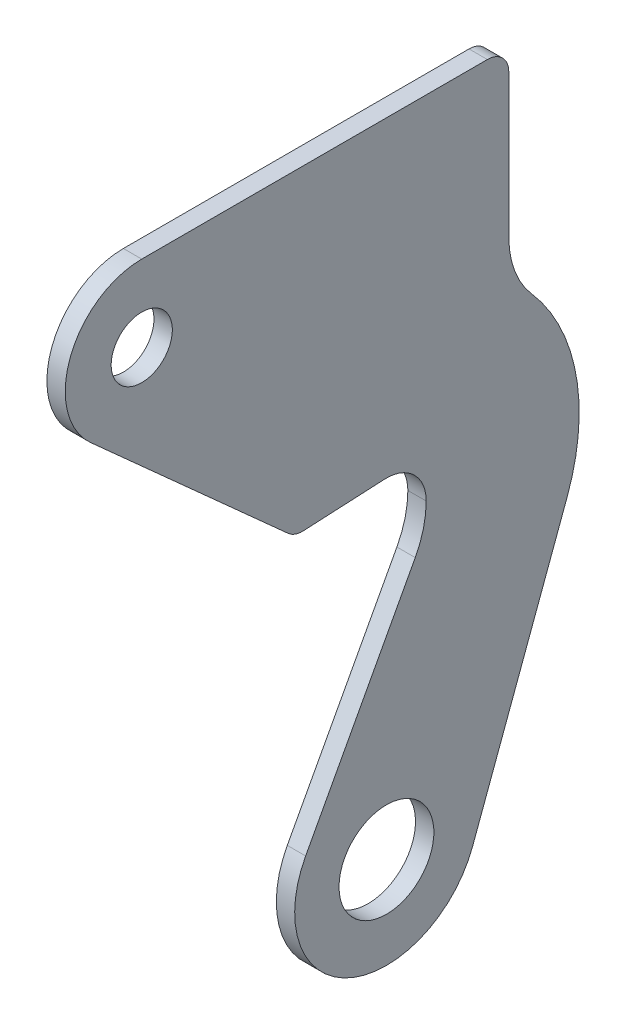
ISO-10303-21;
HEADER;
FILE_DESCRIPTION(('STEP AP214'),'2;1');
FILE_NAME('part.step','',(''),(''),'','','');
FILE_SCHEMA(('AUTOMOTIVE_DESIGN { 1 0 10303 214 1 1 1 1 }'));
ENDSEC;
DATA;
#1=APPLICATION_CONTEXT('core data for automotive mechanical design processes');
#2=APPLICATION_PROTOCOL_DEFINITION('international standard','automotive_design',2000,#1);
#3=PRODUCT_CONTEXT('',#1,'mechanical');
#4=PRODUCT('Part','Part','',(#3));
#5=PRODUCT_RELATED_PRODUCT_CATEGORY('part','',(#4));
#6=PRODUCT_DEFINITION_FORMATION('','',#4);
#7=PRODUCT_DEFINITION_CONTEXT('part definition',#1,'design');
#8=PRODUCT_DEFINITION('design','',#6,#7);
#9=PRODUCT_DEFINITION_SHAPE('','',#8);
#10=(LENGTH_UNIT() NAMED_UNIT(*) SI_UNIT(.MILLI.,.METRE.));
#11=(NAMED_UNIT(*) PLANE_ANGLE_UNIT() SI_UNIT($,.RADIAN.));
#12=(NAMED_UNIT(*) SI_UNIT($,.STERADIAN.) SOLID_ANGLE_UNIT());
#13=UNCERTAINTY_MEASURE_WITH_UNIT(LENGTH_MEASURE(1.E-05),#10,'distance_accuracy_value','');
#14=(GEOMETRIC_REPRESENTATION_CONTEXT(3) GLOBAL_UNCERTAINTY_ASSIGNED_CONTEXT((#13)) GLOBAL_UNIT_ASSIGNED_CONTEXT((#10,
#11,#12)) REPRESENTATION_CONTEXT('',''));
#15=CARTESIAN_POINT('',(0.,0.,0.));
#16=DIRECTION('',(0.,0.,1.));
#17=DIRECTION('',(1.,0.,0.));
#18=AXIS2_PLACEMENT_3D('',#15,#16,#17);
#19=CARTESIAN_POINT('',(0.762,24.13,0.));
#20=DIRECTION('',(-1.,0.,0.));
#21=DIRECTION('',(0.,0.,1.));
#22=AXIS2_PLACEMENT_3D('',#19,#20,#21);
#23=PLANE('',#22);
#24=CARTESIAN_POINT('',(0.762,24.13,0.));
#25=DIRECTION('',(1.,0.,0.));
#26=DIRECTION('',(0.,0.,1.));
#27=AXIS2_PLACEMENT_3D('',#24,#25,#26);
#28=CIRCLE('',#27,16.002);
#29=CARTESIAN_POINT('',(0.762,18.5714105263158,-15.0055352141484));
#30=VERTEX_POINT('',#29);
#31=CARTESIAN_POINT('',(0.762,34.6653516893117,-12.0445161290322));
#32=VERTEX_POINT('',#31);
#33=EDGE_CURVE('E203',#30,#32,#28,.T.);
#34=ORIENTED_EDGE('',*,*,#33,.T.);
#35=CARTESIAN_POINT('',(0.762,39.6821858270791,-17.78));
#36=DIRECTION('',(-1.,0.,0.));
#37=DIRECTION('',(0.,0.,1.));
#38=AXIS2_PLACEMENT_3D('',#35,#36,#37);
#39=CIRCLE('',#38,7.62);
#40=CARTESIAN_POINT('',(0.762,39.6821858270791,-10.16));
#41=VERTEX_POINT('',#40);
#42=EDGE_CURVE('E11',#32,#41,#39,.T.);
#43=ORIENTED_EDGE('',*,*,#42,.T.);
#44=DIRECTION('',(0.,1.,0.));
#45=VECTOR('',#44,1.);
#46=CARTESIAN_POINT('',(0.762,53.34,-10.16));
#47=LINE('',#46,#45);
#48=CARTESIAN_POINT('',(0.762,51.562,-10.16));
#49=VERTEX_POINT('',#48);
#50=EDGE_CURVE('E147',#41,#49,#47,.T.);
#51=ORIENTED_EDGE('',*,*,#50,.T.);
#52=CARTESIAN_POINT('',(0.762,51.562,-8.38199999999999));
#53=DIRECTION('',(-1.,0.,0.));
#54=DIRECTION('',(0.,0.,1.));
#55=AXIS2_PLACEMENT_3D('',#52,#53,#54);
#56=CIRCLE('',#55,1.778);
#57=CARTESIAN_POINT('',(0.762,53.34,-8.38199999999999));
#58=VERTEX_POINT('',#57);
#59=EDGE_CURVE('E143',#49,#58,#56,.F.);
#60=ORIENTED_EDGE('',*,*,#59,.T.);
#61=DIRECTION('',(0.,0.,1.));
#62=VECTOR('',#61,1.);
#63=CARTESIAN_POINT('',(0.762,53.34,20.32));
#64=LINE('',#63,#62);
#65=CARTESIAN_POINT('',(0.762,53.34,20.32));
#66=VERTEX_POINT('',#65);
#67=EDGE_CURVE('E135',#58,#66,#64,.T.);
#68=ORIENTED_EDGE('',*,*,#67,.T.);
#69=CARTESIAN_POINT('',(0.762,46.99,20.32));
#70=DIRECTION('',(1.,0.,0.));
#71=DIRECTION('',(0.,0.,1.));
#72=AXIS2_PLACEMENT_3D('',#69,#70,#71);
#73=CIRCLE('',#72,6.35);
#74=CARTESIAN_POINT('',(0.762,42.2653642791483,24.5626780817371));
#75=VERTEX_POINT('',#74);
#76=EDGE_CURVE('E140',#66,#75,#73,.T.);
#77=ORIENTED_EDGE('',*,*,#76,.T.);
#78=DIRECTION('',(0.,-0.668138280588521,-0.744037121393963));
#79=VECTOR('',#78,1.);
#80=CARTESIAN_POINT('',(0.762,27.051,7.62));
#81=LINE('',#80,#79);
#82=CARTESIAN_POINT('',(0.762,27.5408506966821,8.16549651301392));
#83=VERTEX_POINT('',#82);
#84=EDGE_CURVE('E162',#75,#83,#81,.T.);
#85=ORIENTED_EDGE('',*,*,#84,.T.);
#86=CARTESIAN_POINT('',(0.762,28.8637486985205,6.97754665012753));
#87=DIRECTION('',(-1.,0.,0.));
#88=DIRECTION('',(0.,0.,1.));
#89=AXIS2_PLACEMENT_3D('',#86,#87,#88);
#90=CIRCLE('',#89,1.778);
#91=CARTESIAN_POINT('',(0.762,27.0880163197851,6.88777739530944));
#92=VERTEX_POINT('',#91);
#93=EDGE_CURVE('E231',#83,#92,#90,.F.);
#94=ORIENTED_EDGE('',*,*,#93,.T.);
#95=DIRECTION('',(0.,0.0504888947233312,-0.998724622460874));
#96=VECTOR('',#95,1.);
#97=CARTESIAN_POINT('',(0.762,27.4277887033658,0.166714330376441));
#98=LINE('',#97,#96);
#99=CARTESIAN_POINT('',(0.762,27.4277887033658,0.166714330376441));
#100=VERTEX_POINT('',#99);
#101=EDGE_CURVE('E164',#92,#100,#98,.T.);
#102=ORIENTED_EDGE('',*,*,#101,.T.);
#103=CARTESIAN_POINT('',(0.762,24.13,0.));
#104=DIRECTION('',(-1.,0.,0.));
#105=DIRECTION('',(0.,0.,-1.));
#106=AXIS2_PLACEMENT_3D('',#103,#104,#105);
#107=CIRCLE('',#106,3.302);
#108=CARTESIAN_POINT('',(0.762,24.13,-3.302));
#109=VERTEX_POINT('',#108);
#110=EDGE_CURVE('E169',#100,#109,#107,.T.);
#111=ORIENTED_EDGE('',*,*,#110,.T.);
#112=CARTESIAN_POINT('',(0.762,24.13,4.318));
#113=DIRECTION('',(-1.,0.,0.));
#114=DIRECTION('',(0.,0.,1.));
#115=AXIS2_PLACEMENT_3D('',#112,#113,#114);
#116=CIRCLE('',#115,7.62);
#117=CARTESIAN_POINT('',(0.762,20.518024345724,-2.39154781434023));
#118=VERTEX_POINT('',#117);
#119=EDGE_CURVE('E171',#109,#118,#116,.T.);
#120=ORIENTED_EDGE('',*,*,#119,.T.);
#121=DIRECTION('',(0.,-0.880518085871421,0.474012553054588));
#122=VECTOR('',#121,1.);
#123=CARTESIAN_POINT('',(0.762,20.518024345724,-2.39154781434023));
#124=LINE('',#123,#122);
#125=CARTESIAN_POINT('',(0.762,3.61197565427596,6.70954781434023));
#126=VERTEX_POINT('',#125);
#127=EDGE_CURVE('E173',#118,#126,#124,.T.);
#128=ORIENTED_EDGE('',*,*,#127,.T.);
#129=CARTESIAN_POINT('',(0.762,0.,0.));
#130=DIRECTION('',(1.,0.,0.));
#131=DIRECTION('',(0.,0.,-1.));
#132=AXIS2_PLACEMENT_3D('',#129,#130,#131);
#133=CIRCLE('',#132,7.62);
#134=CARTESIAN_POINT('',(0.762,-2.64694736842105,-7.14549295911828));
#135=VERTEX_POINT('',#134);
#136=EDGE_CURVE('E175',#126,#135,#133,.T.);
#137=ORIENTED_EDGE('',*,*,#136,.T.);
#138=DIRECTION('',(0.,0.937728734792425,-0.347368421052632));
#139=VECTOR('',#138,1.);
#140=CARTESIAN_POINT('',(0.762,18.5714105263158,-15.0055352141484));
#141=LINE('',#140,#139);
#142=EDGE_CURVE('E177',#135,#30,#141,.T.);
#143=ORIENTED_EDGE('',*,*,#142,.T.);
#144=EDGE_LOOP('',(#34,#43,#51,#60,#68,#77,#85,#94,#102,#111,#120,#128,#137,#143));
#145=FACE_BOUND('',#144,.T.);
#146=CARTESIAN_POINT('',(0.762,0.,0.));
#147=DIRECTION('',(1.,0.,0.));
#148=DIRECTION('',(0.,0.,-1.));
#149=AXIS2_PLACEMENT_3D('',#146,#147,#148);
#150=CIRCLE('',#149,3.937);
#151=CARTESIAN_POINT('',(0.762,0.,3.937));
#152=VERTEX_POINT('',#151);
#153=EDGE_CURVE('E183',#152,#152,#150,.T.);
#154=ORIENTED_EDGE('',*,*,#153,.F.);
#155=EDGE_LOOP('',(#154));
#156=FACE_BOUND('',#155,.T.);
#157=CARTESIAN_POINT('',(0.762,46.99,20.32));
#158=DIRECTION('',(1.,0.,0.));
#159=DIRECTION('',(0.,0.,-1.));
#160=AXIS2_PLACEMENT_3D('',#157,#158,#159);
#161=CIRCLE('',#160,2.54000000000001);
#162=CARTESIAN_POINT('',(0.762,46.99,22.86));
#163=VERTEX_POINT('',#162);
#164=EDGE_CURVE('E320',#163,#163,#161,.T.);
#165=ORIENTED_EDGE('',*,*,#164,.F.);
#166=EDGE_LOOP('',(#165));
#167=FACE_BOUND('',#166,.T.);
#168=ADVANCED_FACE('F35',(#145,#156,#167),#23,.F.);
#169=CARTESIAN_POINT('',(-0.762,24.13,0.));
#170=DIRECTION('',(-1.,0.,0.));
#171=DIRECTION('',(0.,0.,1.));
#172=AXIS2_PLACEMENT_3D('',#169,#170,#171);
#173=PLANE('',#172);
#174=CARTESIAN_POINT('',(-0.762,0.,0.));
#175=DIRECTION('',(1.,0.,0.));
#176=DIRECTION('',(0.,0.,-1.));
#177=AXIS2_PLACEMENT_3D('',#174,#175,#176);
#178=CIRCLE('',#177,3.937);
#179=CARTESIAN_POINT('',(-0.762,0.,3.937));
#180=VERTEX_POINT('',#179);
#181=EDGE_CURVE('E317',#180,#180,#178,.T.);
#182=ORIENTED_EDGE('',*,*,#181,.T.);
#183=EDGE_LOOP('',(#182));
#184=FACE_BOUND('',#183,.T.);
#185=DIRECTION('',(0.,0.,1.));
#186=VECTOR('',#185,1.);
#187=CARTESIAN_POINT('',(-0.762,53.34,20.32));
#188=LINE('',#187,#186);
#189=CARTESIAN_POINT('',(-0.762,53.34,-8.38199999999999));
#190=VERTEX_POINT('',#189);
#191=CARTESIAN_POINT('',(-0.762,53.34,20.32));
#192=VERTEX_POINT('',#191);
#193=EDGE_CURVE('E153',#190,#192,#188,.T.);
#194=ORIENTED_EDGE('',*,*,#193,.F.);
#195=CARTESIAN_POINT('',(-0.762,51.562,-8.38199999999999));
#196=DIRECTION('',(-1.,0.,0.));
#197=DIRECTION('',(0.,0.,1.));
#198=AXIS2_PLACEMENT_3D('',#195,#196,#197);
#199=CIRCLE('',#198,1.778);
#200=CARTESIAN_POINT('',(-0.762,51.562,-10.16));
#201=VERTEX_POINT('',#200);
#202=EDGE_CURVE('E225',#190,#201,#199,.T.);
#203=ORIENTED_EDGE('',*,*,#202,.T.);
#204=DIRECTION('',(0.,1.,0.));
#205=VECTOR('',#204,1.);
#206=CARTESIAN_POINT('',(-0.762,53.34,-10.16));
#207=LINE('',#206,#205);
#208=CARTESIAN_POINT('',(-0.762,39.6821858270791,-10.16));
#209=VERTEX_POINT('',#208);
#210=EDGE_CURVE('E182',#209,#201,#207,.T.);
#211=ORIENTED_EDGE('',*,*,#210,.F.);
#212=CARTESIAN_POINT('',(-0.762,39.6821858270791,-17.78));
#213=DIRECTION('',(-1.,0.,0.));
#214=DIRECTION('',(0.,0.,1.));
#215=AXIS2_PLACEMENT_3D('',#212,#213,#214);
#216=CIRCLE('',#215,7.62);
#217=CARTESIAN_POINT('',(-0.762,34.6653516893117,-12.0445161290322));
#218=VERTEX_POINT('',#217);
#219=EDGE_CURVE('E43',#209,#218,#216,.F.);
#220=ORIENTED_EDGE('',*,*,#219,.T.);
#221=CARTESIAN_POINT('',(-0.762,24.13,0.));
#222=DIRECTION('',(1.,0.,0.));
#223=DIRECTION('',(0.,0.,1.));
#224=AXIS2_PLACEMENT_3D('',#221,#222,#223);
#225=CIRCLE('',#224,16.002);
#226=CARTESIAN_POINT('',(-0.762,18.5714105263158,-15.0055352141484));
#227=VERTEX_POINT('',#226);
#228=EDGE_CURVE('E180',#227,#218,#225,.T.);
#229=ORIENTED_EDGE('',*,*,#228,.F.);
#230=DIRECTION('',(0.,0.937728734792425,-0.347368421052632));
#231=VECTOR('',#230,1.);
#232=CARTESIAN_POINT('',(-0.762,18.5714105263158,-15.0055352141484));
#233=LINE('',#232,#231);
#234=CARTESIAN_POINT('',(-0.762,-2.64694736842105,-7.14549295911828));
#235=VERTEX_POINT('',#234);
#236=EDGE_CURVE('E201',#235,#227,#233,.T.);
#237=ORIENTED_EDGE('',*,*,#236,.F.);
#238=CARTESIAN_POINT('',(-0.762,0.,0.));
#239=DIRECTION('',(1.,0.,0.));
#240=DIRECTION('',(0.,0.,-1.));
#241=AXIS2_PLACEMENT_3D('',#238,#239,#240);
#242=CIRCLE('',#241,7.62);
#243=CARTESIAN_POINT('',(-0.762,3.61197565427596,6.70954781434023));
#244=VERTEX_POINT('',#243);
#245=EDGE_CURVE('E199',#244,#235,#242,.T.);
#246=ORIENTED_EDGE('',*,*,#245,.F.);
#247=DIRECTION('',(0.,-0.880518085871421,0.474012553054588));
#248=VECTOR('',#247,1.);
#249=CARTESIAN_POINT('',(-0.762,20.518024345724,-2.39154781434023));
#250=LINE('',#249,#248);
#251=CARTESIAN_POINT('',(-0.762,20.518024345724,-2.39154781434023));
#252=VERTEX_POINT('',#251);
#253=EDGE_CURVE('E197',#252,#244,#250,.T.);
#254=ORIENTED_EDGE('',*,*,#253,.F.);
#255=CARTESIAN_POINT('',(-0.762,24.13,4.318));
#256=DIRECTION('',(-1.,0.,0.));
#257=DIRECTION('',(0.,0.,1.));
#258=AXIS2_PLACEMENT_3D('',#255,#256,#257);
#259=CIRCLE('',#258,7.62);
#260=CARTESIAN_POINT('',(-0.762,24.13,-3.302));
#261=VERTEX_POINT('',#260);
#262=EDGE_CURVE('E195',#261,#252,#259,.T.);
#263=ORIENTED_EDGE('',*,*,#262,.F.);
#264=CARTESIAN_POINT('',(-0.762,24.13,0.));
#265=DIRECTION('',(-1.,0.,0.));
#266=DIRECTION('',(0.,0.,-1.));
#267=AXIS2_PLACEMENT_3D('',#264,#265,#266);
#268=CIRCLE('',#267,3.302);
#269=CARTESIAN_POINT('',(-0.762,27.4277887033658,0.166714330376441));
#270=VERTEX_POINT('',#269);
#271=EDGE_CURVE('E193',#270,#261,#268,.T.);
#272=ORIENTED_EDGE('',*,*,#271,.F.);
#273=DIRECTION('',(0.,0.0504888947233312,-0.998724622460874));
#274=VECTOR('',#273,1.);
#275=CARTESIAN_POINT('',(-0.762,27.4277887033658,0.166714330376441));
#276=LINE('',#275,#274);
#277=CARTESIAN_POINT('',(-0.762,27.0880163197851,6.88777739530944));
#278=VERTEX_POINT('',#277);
#279=EDGE_CURVE('E191',#278,#270,#276,.T.);
#280=ORIENTED_EDGE('',*,*,#279,.F.);
#281=CARTESIAN_POINT('',(-0.762,28.8637486985205,6.97754665012753));
#282=DIRECTION('',(-1.,0.,0.));
#283=DIRECTION('',(0.,0.,1.));
#284=AXIS2_PLACEMENT_3D('',#281,#282,#283);
#285=CIRCLE('',#284,1.778);
#286=CARTESIAN_POINT('',(-0.762,27.5408506966821,8.16549651301392));
#287=VERTEX_POINT('',#286);
#288=EDGE_CURVE('E223',#278,#287,#285,.T.);
#289=ORIENTED_EDGE('',*,*,#288,.T.);
#290=DIRECTION('',(0.,-0.668138280588521,-0.744037121393963));
#291=VECTOR('',#290,1.);
#292=CARTESIAN_POINT('',(-0.762,27.051,7.62));
#293=LINE('',#292,#291);
#294=CARTESIAN_POINT('',(-0.762,42.2653642791483,24.5626780817371));
#295=VERTEX_POINT('',#294);
#296=EDGE_CURVE('E188',#295,#287,#293,.T.);
#297=ORIENTED_EDGE('',*,*,#296,.F.);
#298=CARTESIAN_POINT('',(-0.762,46.99,20.32));
#299=DIRECTION('',(1.,0.,0.));
#300=DIRECTION('',(0.,0.,1.));
#301=AXIS2_PLACEMENT_3D('',#298,#299,#300);
#302=CIRCLE('',#301,6.35);
#303=EDGE_CURVE('E186',#192,#295,#302,.T.);
#304=ORIENTED_EDGE('',*,*,#303,.F.);
#305=EDGE_LOOP('',(#194,#203,#211,#220,#229,#237,#246,#254,#263,#272,#280,#289,#297,#304));
#306=FACE_BOUND('',#305,.T.);
#307=CARTESIAN_POINT('',(-0.762,46.99,20.32));
#308=DIRECTION('',(1.,0.,0.));
#309=DIRECTION('',(0.,0.,-1.));
#310=AXIS2_PLACEMENT_3D('',#307,#308,#309);
#311=CIRCLE('',#310,2.54000000000001);
#312=CARTESIAN_POINT('',(-0.762,46.99,22.86));
#313=VERTEX_POINT('',#312);
#314=EDGE_CURVE('E323',#313,#313,#311,.T.);
#315=ORIENTED_EDGE('',*,*,#314,.T.);
#316=EDGE_LOOP('',(#315));
#317=FACE_BOUND('',#316,.T.);
#318=ADVANCED_FACE('F248',(#184,#306,#317),#173,.T.);
#319=CARTESIAN_POINT('',(0.762,24.13,0.));
#320=DIRECTION('',(-1.,0.,0.));
#321=DIRECTION('',(0.,0.,1.));
#322=AXIS2_PLACEMENT_3D('',#319,#320,#321);
#323=CYLINDRICAL_SURFACE('',#322,16.002);
#324=ORIENTED_EDGE('',*,*,#228,.T.);
#325=DIRECTION('',(-1.,0.,0.));
#326=VECTOR('',#325,1.);
#327=CARTESIAN_POINT('',(0.762,34.6653516893117,-12.0445161290322));
#328=LINE('',#327,#326);
#329=EDGE_CURVE('E50',#218,#32,#328,.F.);
#330=ORIENTED_EDGE('',*,*,#329,.T.);
#331=ORIENTED_EDGE('',*,*,#33,.F.);
#332=DIRECTION('',(-1.,0.,0.));
#333=VECTOR('',#332,1.);
#334=CARTESIAN_POINT('',(0.762,18.5714105263158,-15.0055352141484));
#335=LINE('',#334,#333);
#336=EDGE_CURVE('E179',#30,#227,#335,.T.);
#337=ORIENTED_EDGE('',*,*,#336,.T.);
#338=EDGE_LOOP('',(#324,#330,#331,#337));
#339=FACE_BOUND('',#338,.T.);
#340=ADVANCED_FACE('F271',(#339),#323,.T.);
#341=CARTESIAN_POINT('',(0.762,53.34,-10.16));
#342=DIRECTION('',(0.,0.,1.));
#343=DIRECTION('',(0.,-1.,0.));
#344=AXIS2_PLACEMENT_3D('',#341,#342,#343);
#345=PLANE('',#344);
#346=ORIENTED_EDGE('',*,*,#50,.F.);
#347=DIRECTION('',(1.,0.,0.));
#348=VECTOR('',#347,1.);
#349=CARTESIAN_POINT('',(-0.762,39.6821858270791,-10.16));
#350=LINE('',#349,#348);
#351=EDGE_CURVE('E239',#41,#209,#350,.F.);
#352=ORIENTED_EDGE('',*,*,#351,.T.);
#353=ORIENTED_EDGE('',*,*,#210,.T.);
#354=DIRECTION('',(-1.,0.,0.));
#355=VECTOR('',#354,1.);
#356=CARTESIAN_POINT('',(0.762,51.562,-10.16));
#357=LINE('',#356,#355);
#358=EDGE_CURVE('E228',#201,#49,#357,.F.);
#359=ORIENTED_EDGE('',*,*,#358,.T.);
#360=EDGE_LOOP('',(#346,#352,#353,#359));
#361=FACE_BOUND('',#360,.T.);
#362=ADVANCED_FACE('F245',(#361),#345,.F.);
#363=CARTESIAN_POINT('',(0.762,53.34,20.32));
#364=DIRECTION('',(0.,-1.,0.));
#365=DIRECTION('',(0.,0.,-1.));
#366=AXIS2_PLACEMENT_3D('',#363,#364,#365);
#367=PLANE('',#366);
#368=ORIENTED_EDGE('',*,*,#67,.F.);
#369=DIRECTION('',(-1.,0.,0.));
#370=VECTOR('',#369,1.);
#371=CARTESIAN_POINT('',(0.762,53.34,-8.38199999999999));
#372=LINE('',#371,#370);
#373=EDGE_CURVE('E156',#58,#190,#372,.T.);
#374=ORIENTED_EDGE('',*,*,#373,.T.);
#375=ORIENTED_EDGE('',*,*,#193,.T.);
#376=DIRECTION('',(-1.,0.,0.));
#377=VECTOR('',#376,1.);
#378=CARTESIAN_POINT('',(0.762,53.34,20.32));
#379=LINE('',#378,#377);
#380=EDGE_CURVE('E150',#66,#192,#379,.T.);
#381=ORIENTED_EDGE('',*,*,#380,.F.);
#382=EDGE_LOOP('',(#368,#374,#375,#381));
#383=FACE_BOUND('',#382,.T.);
#384=ADVANCED_FACE('F151',(#383),#367,.F.);
#385=CARTESIAN_POINT('',(0.762,46.99,20.32));
#386=DIRECTION('',(-1.,0.,0.));
#387=DIRECTION('',(0.,0.,1.));
#388=AXIS2_PLACEMENT_3D('',#385,#386,#387);
#389=CYLINDRICAL_SURFACE('',#388,6.35);
#390=ORIENTED_EDGE('',*,*,#303,.T.);
#391=DIRECTION('',(-1.,0.,0.));
#392=VECTOR('',#391,1.);
#393=CARTESIAN_POINT('',(0.762,42.2653642791483,24.5626780817371));
#394=LINE('',#393,#392);
#395=EDGE_CURVE('E157',#75,#295,#394,.T.);
#396=ORIENTED_EDGE('',*,*,#395,.F.);
#397=ORIENTED_EDGE('',*,*,#76,.F.);
#398=ORIENTED_EDGE('',*,*,#380,.T.);
#399=EDGE_LOOP('',(#390,#396,#397,#398));
#400=FACE_BOUND('',#399,.T.);
#401=ADVANCED_FACE('F159',(#400),#389,.T.);
#402=CARTESIAN_POINT('',(0.762,27.051,7.62));
#403=DIRECTION('',(0.,0.744037121393963,-0.668138280588521));
#404=DIRECTION('',(0.,0.668138280588521,0.744037121393963));
#405=AXIS2_PLACEMENT_3D('',#402,#403,#404);
#406=PLANE('',#405);
#407=ORIENTED_EDGE('',*,*,#296,.T.);
#408=DIRECTION('',(-1.,0.,0.));
#409=VECTOR('',#408,1.);
#410=CARTESIAN_POINT('',(0.762,27.5408506966821,8.16549651301392));
#411=LINE('',#410,#409);
#412=EDGE_CURVE('E237',#287,#83,#411,.F.);
#413=ORIENTED_EDGE('',*,*,#412,.T.);
#414=ORIENTED_EDGE('',*,*,#84,.F.);
#415=ORIENTED_EDGE('',*,*,#395,.T.);
#416=EDGE_LOOP('',(#407,#413,#414,#415));
#417=FACE_BOUND('',#416,.T.);
#418=ADVANCED_FACE('F299',(#417),#406,.F.);
#419=CARTESIAN_POINT('',(0.762,27.4277887033658,0.166714330376441));
#420=DIRECTION('',(0.,0.998724622460875,0.0504888947233312));
#421=DIRECTION('',(0.,-0.0504888947233312,0.998724622460875));
#422=AXIS2_PLACEMENT_3D('',#419,#420,#421);
#423=PLANE('',#422);
#424=ORIENTED_EDGE('',*,*,#101,.F.);
#425=DIRECTION('',(-1.,0.,0.));
#426=VECTOR('',#425,1.);
#427=CARTESIAN_POINT('',(0.762,27.0880163197851,6.88777739530945));
#428=LINE('',#427,#426);
#429=EDGE_CURVE('E234',#92,#278,#428,.T.);
#430=ORIENTED_EDGE('',*,*,#429,.T.);
#431=ORIENTED_EDGE('',*,*,#279,.T.);
#432=DIRECTION('',(-1.,0.,0.));
#433=VECTOR('',#432,1.);
#434=CARTESIAN_POINT('',(0.762,27.4277887033658,0.166714330376441));
#435=LINE('',#434,#433);
#436=EDGE_CURVE('E218',#100,#270,#435,.T.);
#437=ORIENTED_EDGE('',*,*,#436,.F.);
#438=EDGE_LOOP('',(#424,#430,#431,#437));
#439=FACE_BOUND('',#438,.T.);
#440=ADVANCED_FACE('F295',(#439),#423,.F.);
#441=CARTESIAN_POINT('',(0.762,24.13,0.));
#442=DIRECTION('',(-1.,0.,0.));
#443=DIRECTION('',(0.,0.,1.));
#444=AXIS2_PLACEMENT_3D('',#441,#442,#443);
#445=CYLINDRICAL_SURFACE('',#444,3.302);
#446=ORIENTED_EDGE('',*,*,#271,.T.);
#447=DIRECTION('',(-1.,0.,0.));
#448=VECTOR('',#447,1.);
#449=CARTESIAN_POINT('',(0.762,24.13,-3.302));
#450=LINE('',#449,#448);
#451=EDGE_CURVE('E215',#109,#261,#450,.T.);
#452=ORIENTED_EDGE('',*,*,#451,.F.);
#453=ORIENTED_EDGE('',*,*,#110,.F.);
#454=ORIENTED_EDGE('',*,*,#436,.T.);
#455=EDGE_LOOP('',(#446,#452,#453,#454));
#456=FACE_BOUND('',#455,.T.);
#457=ADVANCED_FACE('F291',(#456),#445,.F.);
#458=CARTESIAN_POINT('',(0.762,24.13,4.318));
#459=DIRECTION('',(-1.,0.,0.));
#460=DIRECTION('',(0.,0.,1.));
#461=AXIS2_PLACEMENT_3D('',#458,#459,#460);
#462=CYLINDRICAL_SURFACE('',#461,7.62);
#463=ORIENTED_EDGE('',*,*,#262,.T.);
#464=DIRECTION('',(-1.,0.,0.));
#465=VECTOR('',#464,1.);
#466=CARTESIAN_POINT('',(0.762,20.518024345724,-2.39154781434023));
#467=LINE('',#466,#465);
#468=EDGE_CURVE('E212',#118,#252,#467,.T.);
#469=ORIENTED_EDGE('',*,*,#468,.F.);
#470=ORIENTED_EDGE('',*,*,#119,.F.);
#471=ORIENTED_EDGE('',*,*,#451,.T.);
#472=EDGE_LOOP('',(#463,#469,#470,#471));
#473=FACE_BOUND('',#472,.T.);
#474=ADVANCED_FACE('F287',(#473),#462,.F.);
#475=CARTESIAN_POINT('',(0.762,20.518024345724,-2.39154781434023));
#476=DIRECTION('',(0.,-0.474012553054588,-0.880518085871421));
#477=DIRECTION('',(0.,0.880518085871421,-0.474012553054588));
#478=AXIS2_PLACEMENT_3D('',#475,#476,#477);
#479=PLANE('',#478);
#480=ORIENTED_EDGE('',*,*,#253,.T.);
#481=DIRECTION('',(-1.,0.,0.));
#482=VECTOR('',#481,1.);
#483=CARTESIAN_POINT('',(0.762,3.61197565427596,6.70954781434023));
#484=LINE('',#483,#482);
#485=EDGE_CURVE('E209',#126,#244,#484,.T.);
#486=ORIENTED_EDGE('',*,*,#485,.F.);
#487=ORIENTED_EDGE('',*,*,#127,.F.);
#488=ORIENTED_EDGE('',*,*,#468,.T.);
#489=EDGE_LOOP('',(#480,#486,#487,#488));
#490=FACE_BOUND('',#489,.T.);
#491=ADVANCED_FACE('F283',(#490),#479,.F.);
#492=CARTESIAN_POINT('',(0.762,0.,0.));
#493=DIRECTION('',(-1.,0.,0.));
#494=DIRECTION('',(0.,0.,1.));
#495=AXIS2_PLACEMENT_3D('',#492,#493,#494);
#496=CYLINDRICAL_SURFACE('',#495,7.62);
#497=ORIENTED_EDGE('',*,*,#245,.T.);
#498=DIRECTION('',(-1.,0.,0.));
#499=VECTOR('',#498,1.);
#500=CARTESIAN_POINT('',(0.762,-2.64694736842105,-7.14549295911828));
#501=LINE('',#500,#499);
#502=EDGE_CURVE('E206',#135,#235,#501,.T.);
#503=ORIENTED_EDGE('',*,*,#502,.F.);
#504=ORIENTED_EDGE('',*,*,#136,.F.);
#505=ORIENTED_EDGE('',*,*,#485,.T.);
#506=EDGE_LOOP('',(#497,#503,#504,#505));
#507=FACE_BOUND('',#506,.T.);
#508=ADVANCED_FACE('F279',(#507),#496,.T.);
#509=CARTESIAN_POINT('',(0.762,18.5714105263158,-15.0055352141484));
#510=DIRECTION('',(0.,0.347368421052632,0.937728734792425));
#511=DIRECTION('',(0.,-0.937728734792425,0.347368421052632));
#512=AXIS2_PLACEMENT_3D('',#509,#510,#511);
#513=PLANE('',#512);
#514=ORIENTED_EDGE('',*,*,#236,.T.);
#515=ORIENTED_EDGE('',*,*,#336,.F.);
#516=ORIENTED_EDGE('',*,*,#142,.F.);
#517=ORIENTED_EDGE('',*,*,#502,.T.);
#518=EDGE_LOOP('',(#514,#515,#516,#517));
#519=FACE_BOUND('',#518,.T.);
#520=ADVANCED_FACE('F276',(#519),#513,.F.);
#521=CARTESIAN_POINT('',(0.762,0.,0.));
#522=DIRECTION('',(-1.,0.,0.));
#523=DIRECTION('',(0.,0.,1.));
#524=AXIS2_PLACEMENT_3D('',#521,#522,#523);
#525=CYLINDRICAL_SURFACE('',#524,3.937);
#526=CARTESIAN_POINT('',(0.762,0.,3.937));
#527=CARTESIAN_POINT('',(0.746125,0.,3.937));
#528=CARTESIAN_POINT('',(0.73025,0.,3.937));
#529=CARTESIAN_POINT('',(0.6985,0.,3.937));
#530=CARTESIAN_POINT('',(0.682625,0.,3.937));
#531=CARTESIAN_POINT('',(0.650875,0.,3.937));
#532=CARTESIAN_POINT('',(0.635,0.,3.937));
#533=CARTESIAN_POINT('',(0.60325,0.,3.937));
#534=CARTESIAN_POINT('',(0.587375,0.,3.937));
#535=CARTESIAN_POINT('',(0.555625,0.,3.937));
#536=CARTESIAN_POINT('',(0.53975,0.,3.937));
#537=CARTESIAN_POINT('',(0.508,0.,3.937));
#538=CARTESIAN_POINT('',(0.492125,0.,3.937));
#539=CARTESIAN_POINT('',(0.460375,0.,3.937));
#540=CARTESIAN_POINT('',(0.4445,0.,3.937));
#541=CARTESIAN_POINT('',(0.41275,0.,3.937));
#542=CARTESIAN_POINT('',(0.396875,0.,3.937));
#543=CARTESIAN_POINT('',(0.365125,0.,3.937));
#544=CARTESIAN_POINT('',(0.34925,0.,3.937));
#545=CARTESIAN_POINT('',(0.3175,0.,3.937));
#546=CARTESIAN_POINT('',(0.301625,0.,3.937));
#547=CARTESIAN_POINT('',(0.269875,0.,3.937));
#548=CARTESIAN_POINT('',(0.254,0.,3.937));
#549=CARTESIAN_POINT('',(0.22225,0.,3.937));
#550=CARTESIAN_POINT('',(0.206375,0.,3.937));
#551=CARTESIAN_POINT('',(0.174625,0.,3.937));
#552=CARTESIAN_POINT('',(0.15875,0.,3.937));
#553=CARTESIAN_POINT('',(0.127,0.,3.937));
#554=CARTESIAN_POINT('',(0.111125,0.,3.937));
#555=CARTESIAN_POINT('',(0.0793750000000001,0.,3.937));
#556=CARTESIAN_POINT('',(0.0635,0.,3.937));
#557=CARTESIAN_POINT('',(0.03175,0.,3.937));
#558=CARTESIAN_POINT('',(0.015875,0.,3.937));
#559=CARTESIAN_POINT('',(-0.015875,0.,3.937));
#560=CARTESIAN_POINT('',(-0.03175,0.,3.937));
#561=CARTESIAN_POINT('',(-0.0635,0.,3.937));
#562=CARTESIAN_POINT('',(-0.0793750000000001,0.,3.937));
#563=CARTESIAN_POINT('',(-0.111125,0.,3.937));
#564=CARTESIAN_POINT('',(-0.127,0.,3.937));
#565=CARTESIAN_POINT('',(-0.15875,0.,3.937));
#566=CARTESIAN_POINT('',(-0.174625,0.,3.937));
#567=CARTESIAN_POINT('',(-0.206375,0.,3.937));
#568=CARTESIAN_POINT('',(-0.22225,0.,3.937));
#569=CARTESIAN_POINT('',(-0.254,0.,3.937));
#570=CARTESIAN_POINT('',(-0.269875,0.,3.937));
#571=CARTESIAN_POINT('',(-0.301625,0.,3.937));
#572=CARTESIAN_POINT('',(-0.3175,0.,3.937));
#573=CARTESIAN_POINT('',(-0.34925,0.,3.937));
#574=CARTESIAN_POINT('',(-0.365125,0.,3.937));
#575=CARTESIAN_POINT('',(-0.396875,0.,3.937));
#576=CARTESIAN_POINT('',(-0.41275,0.,3.937));
#577=CARTESIAN_POINT('',(-0.4445,0.,3.937));
#578=CARTESIAN_POINT('',(-0.460375,0.,3.937));
#579=CARTESIAN_POINT('',(-0.492125,0.,3.937));
#580=CARTESIAN_POINT('',(-0.508,0.,3.937));
#581=CARTESIAN_POINT('',(-0.53975,0.,3.937));
#582=CARTESIAN_POINT('',(-0.555625,0.,3.937));
#583=CARTESIAN_POINT('',(-0.587375,0.,3.937));
#584=CARTESIAN_POINT('',(-0.60325,0.,3.937));
#585=CARTESIAN_POINT('',(-0.635,0.,3.937));
#586=CARTESIAN_POINT('',(-0.650875,0.,3.937));
#587=CARTESIAN_POINT('',(-0.682625,0.,3.937));
#588=CARTESIAN_POINT('',(-0.6985,0.,3.937));
#589=CARTESIAN_POINT('',(-0.73025,0.,3.937));
#590=CARTESIAN_POINT('',(-0.746125,0.,3.937));
#591=CARTESIAN_POINT('',(-0.762,0.,3.937));
#592=B_SPLINE_CURVE_WITH_KNOTS('',3,(#526,#527,#528,#529,#530,#531,#532,#533,#534,#535,#536,
#537,#538,#539,#540,#541,#542,#543,#544,#545,#546,#547,#548,#549,#550,#551,#552,#553,#554,#555,
#556,#557,#558,#559,#560,#561,#562,#563,#564,#565,#566,#567,#568,#569,#570,#571,#572,#573,#574,
#575,#576,#577,#578,#579,#580,#581,#582,#583,#584,#585,#586,#587,#588,#589,#590,#591),
.UNSPECIFIED.,.F.,.F.,(4,2,2,2,2,2,2,2,2,2,2,2,2,2,2,2,2,2,2,2,2,2,2,2,2,2,2,2,2,2,2,2,4),(0.,
0.047625,0.0952500000000001,0.142875,0.1905,0.238125,0.28575,0.333375,0.381,0.428625,0.47625,
0.523875,0.5715,0.619125,0.66675,0.714375,0.762,0.809625,0.85725,0.904875,0.9525,1.000125,
1.04775,1.095375,1.143,1.190625,1.23825,1.285875,1.3335,1.381125,1.42875,1.476375,1.524),.UNSPECIFIED.);
#593=EDGE_CURVE('BSEAM262',#152,#180,#592,.T.);
#594=ORIENTED_EDGE('',*,*,#153,.T.);
#595=ORIENTED_EDGE('',*,*,#181,.F.);
#596=ORIENTED_EDGE('',*,*,#593,.T.);
#597=ORIENTED_EDGE('',*,*,#593,.F.);
#598=EDGE_LOOP('',(#594,#596,#595,#597));
#599=FACE_BOUND('',#598,.T.);
#600=ADVANCED_FACE('F262',(#599),#525,.F.);
#601=CARTESIAN_POINT('',(0.762,46.99,20.32));
#602=DIRECTION('',(-1.,0.,0.));
#603=DIRECTION('',(0.,0.,1.));
#604=AXIS2_PLACEMENT_3D('',#601,#602,#603);
#605=CYLINDRICAL_SURFACE('',#604,2.54000000000001);
#606=CARTESIAN_POINT('',(0.762,46.99,22.86));
#607=CARTESIAN_POINT('',(0.746125,46.99,22.86));
#608=CARTESIAN_POINT('',(0.73025,46.99,22.86));
#609=CARTESIAN_POINT('',(0.6985,46.99,22.86));
#610=CARTESIAN_POINT('',(0.682625,46.99,22.86));
#611=CARTESIAN_POINT('',(0.650875,46.99,22.86));
#612=CARTESIAN_POINT('',(0.635,46.99,22.86));
#613=CARTESIAN_POINT('',(0.60325,46.99,22.86));
#614=CARTESIAN_POINT('',(0.587375,46.99,22.86));
#615=CARTESIAN_POINT('',(0.555625,46.99,22.86));
#616=CARTESIAN_POINT('',(0.53975,46.99,22.86));
#617=CARTESIAN_POINT('',(0.508,46.99,22.86));
#618=CARTESIAN_POINT('',(0.492125,46.99,22.86));
#619=CARTESIAN_POINT('',(0.460375,46.99,22.86));
#620=CARTESIAN_POINT('',(0.4445,46.99,22.86));
#621=CARTESIAN_POINT('',(0.41275,46.99,22.86));
#622=CARTESIAN_POINT('',(0.396875,46.99,22.86));
#623=CARTESIAN_POINT('',(0.365125,46.99,22.86));
#624=CARTESIAN_POINT('',(0.34925,46.99,22.86));
#625=CARTESIAN_POINT('',(0.3175,46.99,22.86));
#626=CARTESIAN_POINT('',(0.301625,46.99,22.86));
#627=CARTESIAN_POINT('',(0.269875,46.99,22.86));
#628=CARTESIAN_POINT('',(0.254,46.99,22.86));
#629=CARTESIAN_POINT('',(0.22225,46.99,22.86));
#630=CARTESIAN_POINT('',(0.206375,46.99,22.86));
#631=CARTESIAN_POINT('',(0.174625,46.99,22.86));
#632=CARTESIAN_POINT('',(0.15875,46.99,22.86));
#633=CARTESIAN_POINT('',(0.127,46.99,22.86));
#634=CARTESIAN_POINT('',(0.111125,46.99,22.86));
#635=CARTESIAN_POINT('',(0.0793750000000001,46.99,22.86));
#636=CARTESIAN_POINT('',(0.0635,46.99,22.86));
#637=CARTESIAN_POINT('',(0.03175,46.99,22.86));
#638=CARTESIAN_POINT('',(0.015875,46.99,22.86));
#639=CARTESIAN_POINT('',(-0.015875,46.99,22.86));
#640=CARTESIAN_POINT('',(-0.03175,46.99,22.86));
#641=CARTESIAN_POINT('',(-0.0635,46.99,22.86));
#642=CARTESIAN_POINT('',(-0.0793750000000001,46.99,22.86));
#643=CARTESIAN_POINT('',(-0.111125,46.99,22.86));
#644=CARTESIAN_POINT('',(-0.127,46.99,22.86));
#645=CARTESIAN_POINT('',(-0.15875,46.99,22.86));
#646=CARTESIAN_POINT('',(-0.174625,46.99,22.86));
#647=CARTESIAN_POINT('',(-0.206375,46.99,22.86));
#648=CARTESIAN_POINT('',(-0.22225,46.99,22.86));
#649=CARTESIAN_POINT('',(-0.254,46.99,22.86));
#650=CARTESIAN_POINT('',(-0.269875,46.99,22.86));
#651=CARTESIAN_POINT('',(-0.301625,46.99,22.86));
#652=CARTESIAN_POINT('',(-0.3175,46.99,22.86));
#653=CARTESIAN_POINT('',(-0.34925,46.99,22.86));
#654=CARTESIAN_POINT('',(-0.365125,46.99,22.86));
#655=CARTESIAN_POINT('',(-0.396875,46.99,22.86));
#656=CARTESIAN_POINT('',(-0.41275,46.99,22.86));
#657=CARTESIAN_POINT('',(-0.4445,46.99,22.86));
#658=CARTESIAN_POINT('',(-0.460375,46.99,22.86));
#659=CARTESIAN_POINT('',(-0.492125,46.99,22.86));
#660=CARTESIAN_POINT('',(-0.508,46.99,22.86));
#661=CARTESIAN_POINT('',(-0.53975,46.99,22.86));
#662=CARTESIAN_POINT('',(-0.555625,46.99,22.86));
#663=CARTESIAN_POINT('',(-0.587375,46.99,22.86));
#664=CARTESIAN_POINT('',(-0.60325,46.99,22.86));
#665=CARTESIAN_POINT('',(-0.635,46.99,22.86));
#666=CARTESIAN_POINT('',(-0.650875,46.99,22.86));
#667=CARTESIAN_POINT('',(-0.682625,46.99,22.86));
#668=CARTESIAN_POINT('',(-0.6985,46.99,22.86));
#669=CARTESIAN_POINT('',(-0.73025,46.99,22.86));
#670=CARTESIAN_POINT('',(-0.746125,46.99,22.86));
#671=CARTESIAN_POINT('',(-0.762,46.99,22.86));
#672=B_SPLINE_CURVE_WITH_KNOTS('',3,(#606,#607,#608,#609,#610,#611,#612,#613,#614,#615,#616,
#617,#618,#619,#620,#621,#622,#623,#624,#625,#626,#627,#628,#629,#630,#631,#632,#633,#634,#635,
#636,#637,#638,#639,#640,#641,#642,#643,#644,#645,#646,#647,#648,#649,#650,#651,#652,#653,#654,
#655,#656,#657,#658,#659,#660,#661,#662,#663,#664,#665,#666,#667,#668,#669,#670,#671),
.UNSPECIFIED.,.F.,.F.,(4,2,2,2,2,2,2,2,2,2,2,2,2,2,2,2,2,2,2,2,2,2,2,2,2,2,2,2,2,2,2,2,4),(0.,
0.047625,0.0952500000000001,0.142875,0.1905,0.238125,0.28575,0.333375,0.381,0.428625,0.47625,
0.523875,0.5715,0.619125,0.66675,0.714375,0.762,0.809625,0.85725,0.904875,0.9525,1.000125,
1.04775,1.095375,1.143,1.190625,1.23825,1.285875,1.3335,1.381125,1.42875,1.476375,1.524),.UNSPECIFIED.);
#673=EDGE_CURVE('BSEAM255',#163,#313,#672,.T.);
#674=ORIENTED_EDGE('',*,*,#164,.T.);
#675=ORIENTED_EDGE('',*,*,#314,.F.);
#676=ORIENTED_EDGE('',*,*,#673,.T.);
#677=ORIENTED_EDGE('',*,*,#673,.F.);
#678=EDGE_LOOP('',(#674,#676,#675,#677));
#679=FACE_BOUND('',#678,.T.);
#680=ADVANCED_FACE('F255',(#679),#605,.F.);
#681=CARTESIAN_POINT('',(0.762,51.562,-8.38199999999999));
#682=DIRECTION('',(-1.,0.,0.));
#683=DIRECTION('',(0.,0.,1.));
#684=AXIS2_PLACEMENT_3D('',#681,#682,#683);
#685=CYLINDRICAL_SURFACE('',#684,1.778);
#686=ORIENTED_EDGE('',*,*,#59,.F.);
#687=ORIENTED_EDGE('',*,*,#358,.F.);
#688=ORIENTED_EDGE('',*,*,#202,.F.);
#689=ORIENTED_EDGE('',*,*,#373,.F.);
#690=EDGE_LOOP('',(#686,#687,#688,#689));
#691=FACE_BOUND('',#690,.T.);
#692=ADVANCED_FACE('F252',(#691),#685,.T.);
#693=CARTESIAN_POINT('',(0.762,28.8637486985205,6.97754665012753));
#694=DIRECTION('',(-1.,0.,0.));
#695=DIRECTION('',(0.,0.,1.));
#696=AXIS2_PLACEMENT_3D('',#693,#694,#695);
#697=CYLINDRICAL_SURFACE('',#696,1.778);
#698=ORIENTED_EDGE('',*,*,#93,.F.);
#699=ORIENTED_EDGE('',*,*,#412,.F.);
#700=ORIENTED_EDGE('',*,*,#288,.F.);
#701=ORIENTED_EDGE('',*,*,#429,.F.);
#702=EDGE_LOOP('',(#698,#699,#700,#701));
#703=FACE_BOUND('',#702,.T.);
#704=ADVANCED_FACE('F254',(#703),#697,.T.);
#705=CARTESIAN_POINT('',(0.762,39.6821858270791,-17.78));
#706=DIRECTION('',(-1.,0.,0.));
#707=DIRECTION('',(0.,0.,1.));
#708=AXIS2_PLACEMENT_3D('',#705,#706,#707);
#709=CYLINDRICAL_SURFACE('',#708,7.62);
#710=ORIENTED_EDGE('',*,*,#42,.F.);
#711=ORIENTED_EDGE('',*,*,#329,.F.);
#712=ORIENTED_EDGE('',*,*,#219,.F.);
#713=ORIENTED_EDGE('',*,*,#351,.F.);
#714=EDGE_LOOP('',(#710,#711,#712,#713));
#715=FACE_BOUND('',#714,.T.);
#716=ADVANCED_FACE('F37',(#715),#709,.F.);
#717=CLOSED_SHELL('',(#168,#318,#340,#362,#384,#401,#418,#440,#457,#474,#491,#508,#520,#600,
#680,#692,#704,#716));
#718=MANIFOLD_SOLID_BREP('B2',#717);
#719=ADVANCED_BREP_SHAPE_REPRESENTATION('',(#18,#718),#14);
#720=SHAPE_DEFINITION_REPRESENTATION(#9,#719);
ENDSEC;
END-ISO-10303-21;
